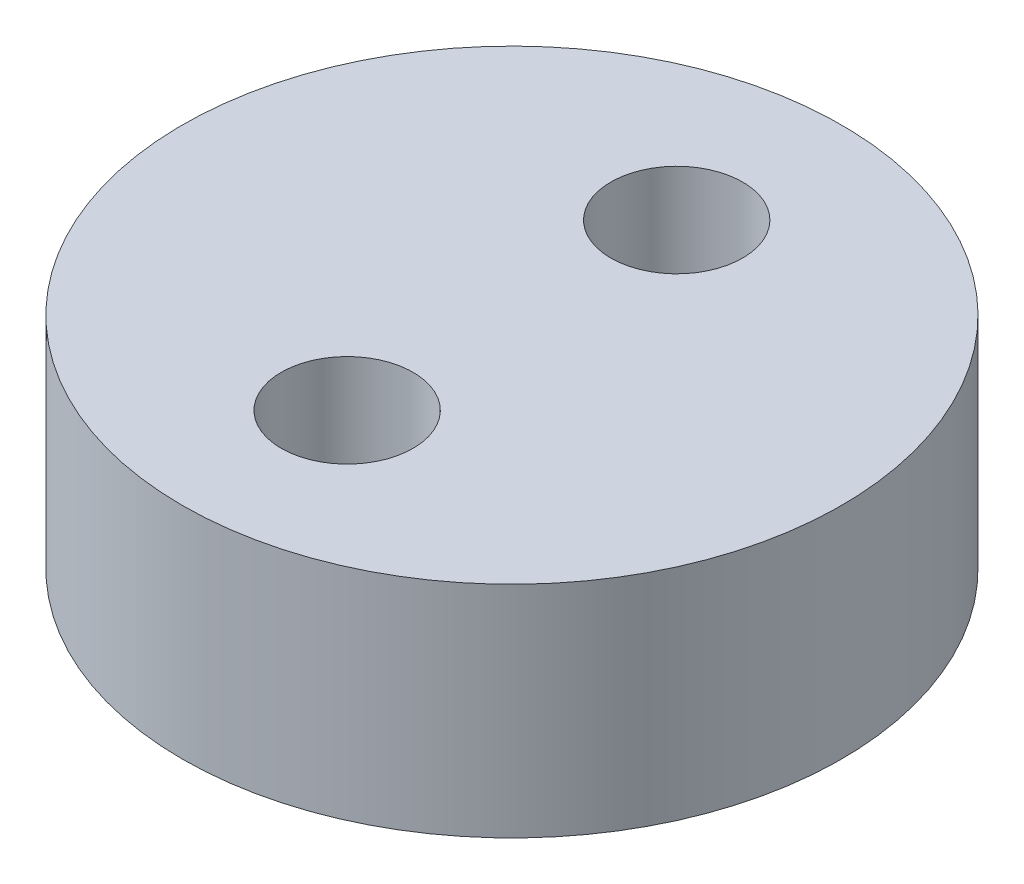
ISO-10303-21;
HEADER;
FILE_DESCRIPTION(('STEP AP214'),'2;1');
FILE_NAME('part.step','',(''),(''),'','','');
FILE_SCHEMA(('AUTOMOTIVE_DESIGN { 1 0 10303 214 1 1 1 1 }'));
ENDSEC;
DATA;
#1=APPLICATION_CONTEXT('core data for automotive mechanical design processes');
#2=APPLICATION_PROTOCOL_DEFINITION('international standard','automotive_design',2000,#1);
#3=PRODUCT_CONTEXT('',#1,'mechanical');
#4=PRODUCT('Part','Part','',(#3));
#5=PRODUCT_RELATED_PRODUCT_CATEGORY('part','',(#4));
#6=PRODUCT_DEFINITION_FORMATION('','',#4);
#7=PRODUCT_DEFINITION_CONTEXT('part definition',#1,'design');
#8=PRODUCT_DEFINITION('design','',#6,#7);
#9=PRODUCT_DEFINITION_SHAPE('','',#8);
#10=(LENGTH_UNIT() NAMED_UNIT(*) SI_UNIT(.MILLI.,.METRE.));
#11=(NAMED_UNIT(*) PLANE_ANGLE_UNIT() SI_UNIT($,.RADIAN.));
#12=(NAMED_UNIT(*) SI_UNIT($,.STERADIAN.) SOLID_ANGLE_UNIT());
#13=UNCERTAINTY_MEASURE_WITH_UNIT(LENGTH_MEASURE(1.E-05),#10,'distance_accuracy_value','');
#14=(GEOMETRIC_REPRESENTATION_CONTEXT(3) GLOBAL_UNCERTAINTY_ASSIGNED_CONTEXT((#13)) GLOBAL_UNIT_ASSIGNED_CONTEXT((#10,
#11,#12)) REPRESENTATION_CONTEXT('',''));
#15=CARTESIAN_POINT('',(0.,0.,0.));
#16=DIRECTION('',(0.,0.,1.));
#17=DIRECTION('',(1.,0.,0.));
#18=AXIS2_PLACEMENT_3D('',#15,#16,#17);
#19=CARTESIAN_POINT('',(0.,10.,0.));
#20=DIRECTION('',(0.,1.,0.));
#21=DIRECTION('',(0.,0.,1.));
#22=AXIS2_PLACEMENT_3D('',#19,#20,#21);
#23=PLANE('',#22);
#24=CARTESIAN_POINT('',(0.,10.,-7.5));
#25=DIRECTION('',(0.,1.,0.));
#26=DIRECTION('',(0.,0.,1.));
#27=AXIS2_PLACEMENT_3D('',#24,#25,#26);
#28=CIRCLE('',#27,3.);
#29=CARTESIAN_POINT('',(0.,10.,-4.5));
#30=VERTEX_POINT('',#29);
#31=EDGE_CURVE('E42',#30,#30,#28,.T.);
#32=ORIENTED_EDGE('',*,*,#31,.F.);
#33=EDGE_LOOP('',(#32));
#34=FACE_BOUND('',#33,.T.);
#35=CARTESIAN_POINT('',(0.,10.,0.));
#36=DIRECTION('',(0.,1.,0.));
#37=DIRECTION('',(0.,0.,1.));
#38=AXIS2_PLACEMENT_3D('',#35,#36,#37);
#39=CIRCLE('',#38,15.);
#40=CARTESIAN_POINT('',(0.,10.,15.));
#41=VERTEX_POINT('',#40);
#42=EDGE_CURVE('E10',#41,#41,#39,.T.);
#43=ORIENTED_EDGE('',*,*,#42,.T.);
#44=EDGE_LOOP('',(#43));
#45=FACE_BOUND('',#44,.T.);
#46=CARTESIAN_POINT('',(0.,10.,7.5));
#47=DIRECTION('',(0.,1.,0.));
#48=DIRECTION('',(0.,0.,1.));
#49=AXIS2_PLACEMENT_3D('',#46,#47,#48);
#50=CIRCLE('',#49,3.);
#51=CARTESIAN_POINT('',(0.,10.,10.5));
#52=VERTEX_POINT('',#51);
#53=EDGE_CURVE('E47',#52,#52,#50,.T.);
#54=ORIENTED_EDGE('',*,*,#53,.F.);
#55=EDGE_LOOP('',(#54));
#56=FACE_BOUND('',#55,.T.);
#57=ADVANCED_FACE('F31',(#34,#45,#56),#23,.T.);
#58=CARTESIAN_POINT('',(0.,0.,0.));
#59=DIRECTION('',(0.,1.,0.));
#60=DIRECTION('',(0.,0.,1.));
#61=AXIS2_PLACEMENT_3D('',#58,#59,#60);
#62=PLANE('',#61);
#63=CARTESIAN_POINT('',(0.,0.,0.));
#64=DIRECTION('',(0.,1.,0.));
#65=DIRECTION('',(0.,0.,1.));
#66=AXIS2_PLACEMENT_3D('',#63,#64,#65);
#67=CIRCLE('',#66,15.);
#68=CARTESIAN_POINT('',(0.,0.,15.));
#69=VERTEX_POINT('',#68);
#70=EDGE_CURVE('E35',#69,#69,#67,.T.);
#71=ORIENTED_EDGE('',*,*,#70,.F.);
#72=EDGE_LOOP('',(#71));
#73=FACE_BOUND('',#72,.T.);
#74=CARTESIAN_POINT('',(0.,0.,-7.5));
#75=DIRECTION('',(0.,1.,0.));
#76=DIRECTION('',(0.,0.,1.));
#77=AXIS2_PLACEMENT_3D('',#74,#75,#76);
#78=CIRCLE('',#77,3.);
#79=CARTESIAN_POINT('',(0.,0.,-4.5));
#80=VERTEX_POINT('',#79);
#81=EDGE_CURVE('E44',#80,#80,#78,.T.);
#82=ORIENTED_EDGE('',*,*,#81,.T.);
#83=EDGE_LOOP('',(#82));
#84=FACE_BOUND('',#83,.T.);
#85=CARTESIAN_POINT('',(0.,0.,7.5));
#86=DIRECTION('',(0.,1.,0.));
#87=DIRECTION('',(0.,0.,1.));
#88=AXIS2_PLACEMENT_3D('',#85,#86,#87);
#89=CIRCLE('',#88,3.);
#90=CARTESIAN_POINT('',(0.,0.,10.5));
#91=VERTEX_POINT('',#90);
#92=EDGE_CURVE('E50',#91,#91,#89,.T.);
#93=ORIENTED_EDGE('',*,*,#92,.T.);
#94=EDGE_LOOP('',(#93));
#95=FACE_BOUND('',#94,.T.);
#96=ADVANCED_FACE('F60',(#73,#84,#95),#62,.F.);
#97=CARTESIAN_POINT('',(0.,10.,0.));
#98=DIRECTION('',(0.,-1.,0.));
#99=DIRECTION('',(0.,0.,-1.));
#100=AXIS2_PLACEMENT_3D('',#97,#98,#99);
#101=CYLINDRICAL_SURFACE('',#100,15.);
#102=ORIENTED_EDGE('',*,*,#42,.F.);
#103=EDGE_LOOP('',(#102));
#104=FACE_BOUND('',#103,.T.);
#105=ORIENTED_EDGE('',*,*,#70,.T.);
#106=EDGE_LOOP('',(#105));
#107=FACE_BOUND('',#106,.T.);
#108=ADVANCED_FACE('F33',(#104,#107),#101,.T.);
#109=CARTESIAN_POINT('',(0.,10.,-7.5));
#110=DIRECTION('',(0.,-1.,0.));
#111=DIRECTION('',(0.,0.,-1.));
#112=AXIS2_PLACEMENT_3D('',#109,#110,#111);
#113=CYLINDRICAL_SURFACE('',#112,3.);
#114=ORIENTED_EDGE('',*,*,#31,.T.);
#115=EDGE_LOOP('',(#114));
#116=FACE_BOUND('',#115,.T.);
#117=ORIENTED_EDGE('',*,*,#81,.F.);
#118=EDGE_LOOP('',(#117));
#119=FACE_BOUND('',#118,.T.);
#120=ADVANCED_FACE('F69',(#116,#119),#113,.F.);
#121=CARTESIAN_POINT('',(0.,10.,7.5));
#122=DIRECTION('',(0.,-1.,0.));
#123=DIRECTION('',(0.,0.,-1.));
#124=AXIS2_PLACEMENT_3D('',#121,#122,#123);
#125=CYLINDRICAL_SURFACE('',#124,3.);
#126=ORIENTED_EDGE('',*,*,#53,.T.);
#127=EDGE_LOOP('',(#126));
#128=FACE_BOUND('',#127,.T.);
#129=ORIENTED_EDGE('',*,*,#92,.F.);
#130=EDGE_LOOP('',(#129));
#131=FACE_BOUND('',#130,.T.);
#132=ADVANCED_FACE('F56',(#128,#131),#125,.F.);
#133=CLOSED_SHELL('',(#57,#96,#108,#120,#132));
#134=MANIFOLD_SOLID_BREP('B2',#133);
#135=ADVANCED_BREP_SHAPE_REPRESENTATION('',(#18,#134),#14);
#136=SHAPE_DEFINITION_REPRESENTATION(#9,#135);
ENDSEC;
END-ISO-10303-21;
